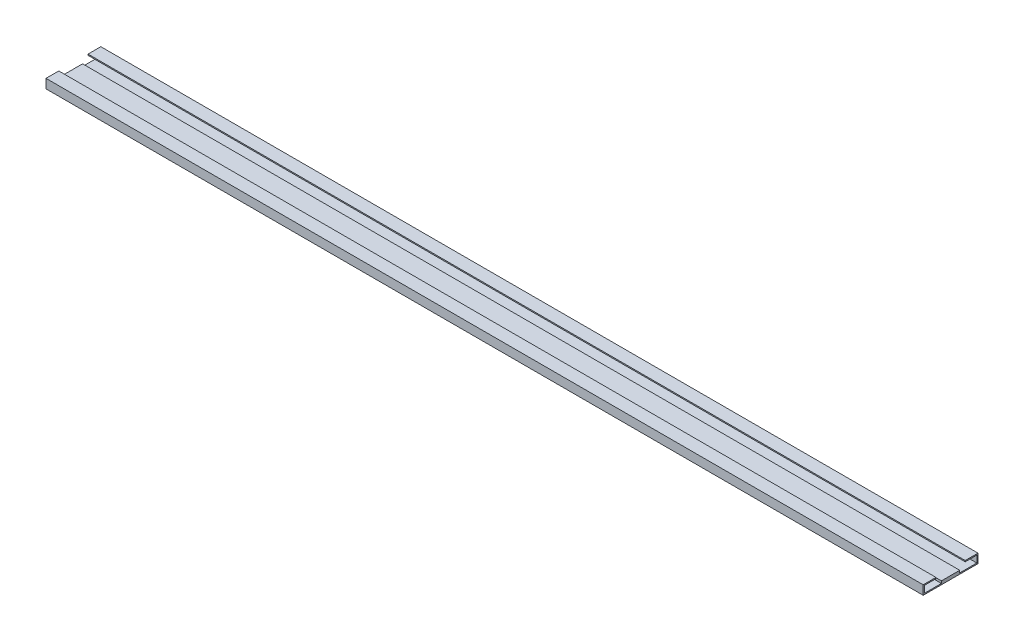
ISO-10303-21;
HEADER;
FILE_DESCRIPTION(('STEP AP214'),'2;1');
FILE_NAME('part.step','',(''),(''),'','','');
FILE_SCHEMA(('AUTOMOTIVE_DESIGN { 1 0 10303 214 1 1 1 1 }'));
ENDSEC;
DATA;
#1=APPLICATION_CONTEXT('core data for automotive mechanical design processes');
#2=APPLICATION_PROTOCOL_DEFINITION('international standard','automotive_design',2000,#1);
#3=PRODUCT_CONTEXT('',#1,'mechanical');
#4=PRODUCT('Part','Part','',(#3));
#5=PRODUCT_RELATED_PRODUCT_CATEGORY('part','',(#4));
#6=PRODUCT_DEFINITION_FORMATION('','',#4);
#7=PRODUCT_DEFINITION_CONTEXT('part definition',#1,'design');
#8=PRODUCT_DEFINITION('design','',#6,#7);
#9=PRODUCT_DEFINITION_SHAPE('','',#8);
#10=(LENGTH_UNIT() NAMED_UNIT(*) SI_UNIT(.MILLI.,.METRE.));
#11=(NAMED_UNIT(*) PLANE_ANGLE_UNIT() SI_UNIT($,.RADIAN.));
#12=(NAMED_UNIT(*) SI_UNIT($,.STERADIAN.) SOLID_ANGLE_UNIT());
#13=UNCERTAINTY_MEASURE_WITH_UNIT(LENGTH_MEASURE(1.E-05),#10,'distance_accuracy_value','');
#14=(GEOMETRIC_REPRESENTATION_CONTEXT(3) GLOBAL_UNCERTAINTY_ASSIGNED_CONTEXT((#13)) GLOBAL_UNIT_ASSIGNED_CONTEXT((#10,
#11,#12)) REPRESENTATION_CONTEXT('',''));
#15=CARTESIAN_POINT('',(0.,0.,0.));
#16=DIRECTION('',(0.,0.,1.));
#17=DIRECTION('',(1.,0.,0.));
#18=AXIS2_PLACEMENT_3D('',#15,#16,#17);
#19=CARTESIAN_POINT('',(0.,6.35,0.));
#20=DIRECTION('',(0.,-1.,0.));
#21=DIRECTION('',(0.,0.,-1.));
#22=AXIS2_PLACEMENT_3D('',#19,#20,#21);
#23=PLANE('',#22);
#24=DIRECTION('',(0.,0.,-1.));
#25=VECTOR('',#24,1.);
#26=CARTESIAN_POINT('',(304.8,6.35,19.05));
#27=LINE('',#26,#25);
#28=CARTESIAN_POINT('',(304.8,6.35,19.05));
#29=VERTEX_POINT('',#28);
#30=CARTESIAN_POINT('',(304.8,6.35,10.16));
#31=VERTEX_POINT('',#30);
#32=EDGE_CURVE('E253',#29,#31,#27,.T.);
#33=ORIENTED_EDGE('',*,*,#32,.T.);
#34=DIRECTION('',(-1.,0.,0.));
#35=VECTOR('',#34,1.);
#36=CARTESIAN_POINT('',(304.8,6.35,10.16));
#37=LINE('',#36,#35);
#38=CARTESIAN_POINT('',(-304.8,6.35,10.16));
#39=VERTEX_POINT('',#38);
#40=EDGE_CURVE('E231',#31,#39,#37,.T.);
#41=ORIENTED_EDGE('',*,*,#40,.T.);
#42=DIRECTION('',(0.,0.,1.));
#43=VECTOR('',#42,1.);
#44=CARTESIAN_POINT('',(-304.8,6.35,19.05));
#45=LINE('',#44,#43);
#46=CARTESIAN_POINT('',(-304.8,6.35,19.05));
#47=VERTEX_POINT('',#46);
#48=EDGE_CURVE('E257',#39,#47,#45,.T.);
#49=ORIENTED_EDGE('',*,*,#48,.T.);
#50=DIRECTION('',(1.,0.,0.));
#51=VECTOR('',#50,1.);
#52=CARTESIAN_POINT('',(-304.8,6.35,19.05));
#53=LINE('',#52,#51);
#54=EDGE_CURVE('E58',#47,#29,#53,.T.);
#55=ORIENTED_EDGE('',*,*,#54,.T.);
#56=EDGE_LOOP('',(#33,#41,#49,#55));
#57=FACE_BOUND('',#56,.T.);
#58=ADVANCED_FACE('F34',(#57),#23,.F.);
#59=CARTESIAN_POINT('',(304.8,6.35,19.05));
#60=DIRECTION('',(-1.,0.,0.));
#61=DIRECTION('',(0.,0.,1.));
#62=AXIS2_PLACEMENT_3D('',#59,#60,#61);
#63=PLANE('',#62);
#64=DIRECTION('',(0.,0.,-1.));
#65=VECTOR('',#64,1.);
#66=CARTESIAN_POINT('',(304.8,5.55625,18.25625));
#67=LINE('',#66,#65);
#68=CARTESIAN_POINT('',(304.8,5.55625,18.25625));
#69=VERTEX_POINT('',#68);
#70=CARTESIAN_POINT('',(304.8,5.55625,10.16));
#71=VERTEX_POINT('',#70);
#72=EDGE_CURVE('E200',#69,#71,#67,.T.);
#73=ORIENTED_EDGE('',*,*,#72,.T.);
#74=DIRECTION('',(0.,1.,0.));
#75=VECTOR('',#74,1.);
#76=CARTESIAN_POINT('',(304.8,5.55625,10.16));
#77=LINE('',#76,#75);
#78=EDGE_CURVE('E202',#71,#31,#77,.T.);
#79=ORIENTED_EDGE('',*,*,#78,.T.);
#80=ORIENTED_EDGE('',*,*,#32,.F.);
#81=DIRECTION('',(0.,-1.,0.));
#82=VECTOR('',#81,1.);
#83=CARTESIAN_POINT('',(304.8,6.35,19.05));
#84=LINE('',#83,#82);
#85=CARTESIAN_POINT('',(304.8,0.,19.05));
#86=VERTEX_POINT('',#85);
#87=EDGE_CURVE('E262',#29,#86,#84,.T.);
#88=ORIENTED_EDGE('',*,*,#87,.T.);
#89=DIRECTION('',(0.,0.,-1.));
#90=VECTOR('',#89,1.);
#91=CARTESIAN_POINT('',(304.8,0.,19.05));
#92=LINE('',#91,#90);
#93=CARTESIAN_POINT('',(304.8,0.,-19.05));
#94=VERTEX_POINT('',#93);
#95=EDGE_CURVE('E234',#86,#94,#92,.T.);
#96=ORIENTED_EDGE('',*,*,#95,.T.);
#97=DIRECTION('',(0.,-1.,0.));
#98=VECTOR('',#97,1.);
#99=CARTESIAN_POINT('',(304.8,6.35,-19.05));
#100=LINE('',#99,#98);
#101=CARTESIAN_POINT('',(304.8,6.35,-19.05));
#102=VERTEX_POINT('',#101);
#103=EDGE_CURVE('E11',#102,#94,#100,.T.);
#104=ORIENTED_EDGE('',*,*,#103,.F.);
#105=CARTESIAN_POINT('',(304.8,6.35,-10.16));
#106=VERTEX_POINT('',#105);
#107=EDGE_CURVE('E86',#106,#102,#27,.T.);
#108=ORIENTED_EDGE('',*,*,#107,.F.);
#109=DIRECTION('',(0.,-1.,0.));
#110=VECTOR('',#109,1.);
#111=CARTESIAN_POINT('',(304.8,6.35,-10.16));
#112=LINE('',#111,#110);
#113=CARTESIAN_POINT('',(304.8,5.55625,-10.16));
#114=VERTEX_POINT('',#113);
#115=EDGE_CURVE('E49',#106,#114,#112,.T.);
#116=ORIENTED_EDGE('',*,*,#115,.T.);
#117=DIRECTION('',(0.,0.,-1.));
#118=VECTOR('',#117,1.);
#119=CARTESIAN_POINT('',(304.8,5.55625,-10.16));
#120=LINE('',#119,#118);
#121=CARTESIAN_POINT('',(304.8,5.55625,-18.25625));
#122=VERTEX_POINT('',#121);
#123=EDGE_CURVE('E167',#114,#122,#120,.T.);
#124=ORIENTED_EDGE('',*,*,#123,.T.);
#125=DIRECTION('',(0.,-1.,0.));
#126=VECTOR('',#125,1.);
#127=CARTESIAN_POINT('',(304.8,5.55625,-18.25625));
#128=LINE('',#127,#126);
#129=CARTESIAN_POINT('',(304.8,0.79375,-18.25625));
#130=VERTEX_POINT('',#129);
#131=EDGE_CURVE('E172',#122,#130,#128,.T.);
#132=ORIENTED_EDGE('',*,*,#131,.T.);
#133=DIRECTION('',(0.,0.,1.));
#134=VECTOR('',#133,1.);
#135=CARTESIAN_POINT('',(304.8,0.79375,-18.25625));
#136=LINE('',#135,#134);
#137=CARTESIAN_POINT('',(304.8,0.79375,-6.35));
#138=VERTEX_POINT('',#137);
#139=EDGE_CURVE('E182',#130,#138,#136,.T.);
#140=ORIENTED_EDGE('',*,*,#139,.T.);
#141=DIRECTION('',(0.,1.,0.));
#142=VECTOR('',#141,1.);
#143=CARTESIAN_POINT('',(304.8,0.79375,-6.35));
#144=LINE('',#143,#142);
#145=CARTESIAN_POINT('',(304.8,2.38125,-6.35));
#146=VERTEX_POINT('',#145);
#147=EDGE_CURVE('E185',#138,#146,#144,.T.);
#148=ORIENTED_EDGE('',*,*,#147,.T.);
#149=DIRECTION('',(0.,0.,1.));
#150=VECTOR('',#149,1.);
#151=CARTESIAN_POINT('',(304.8,2.38125,-6.35));
#152=LINE('',#151,#150);
#153=CARTESIAN_POINT('',(304.8,2.38125,6.35));
#154=VERTEX_POINT('',#153);
#155=EDGE_CURVE('E188',#146,#154,#152,.T.);
#156=ORIENTED_EDGE('',*,*,#155,.T.);
#157=DIRECTION('',(0.,-1.,0.));
#158=VECTOR('',#157,1.);
#159=CARTESIAN_POINT('',(304.8,2.38125,6.35));
#160=LINE('',#159,#158);
#161=CARTESIAN_POINT('',(304.8,0.79375,6.35));
#162=VERTEX_POINT('',#161);
#163=EDGE_CURVE('E191',#154,#162,#160,.T.);
#164=ORIENTED_EDGE('',*,*,#163,.T.);
#165=DIRECTION('',(0.,0.,1.));
#166=VECTOR('',#165,1.);
#167=CARTESIAN_POINT('',(304.8,0.79375,6.35));
#168=LINE('',#167,#166);
#169=CARTESIAN_POINT('',(304.8,0.79375,18.25625));
#170=VERTEX_POINT('',#169);
#171=EDGE_CURVE('E194',#162,#170,#168,.T.);
#172=ORIENTED_EDGE('',*,*,#171,.T.);
#173=DIRECTION('',(0.,1.,0.));
#174=VECTOR('',#173,1.);
#175=CARTESIAN_POINT('',(304.8,0.79375,18.25625));
#176=LINE('',#175,#174);
#177=EDGE_CURVE('E197',#170,#69,#176,.T.);
#178=ORIENTED_EDGE('',*,*,#177,.T.);
#179=EDGE_LOOP('',(#73,#79,#80,#88,#96,#104,#108,#116,#124,#132,#140,#148,#156,#164,#172,#178));
#180=FACE_BOUND('',#179,.T.);
#181=ADVANCED_FACE('F36',(#180),#63,.F.);
#182=CARTESIAN_POINT('',(-304.8,6.35,-19.05));
#183=DIRECTION('',(0.,0.,1.));
#184=DIRECTION('',(1.,0.,0.));
#185=AXIS2_PLACEMENT_3D('',#182,#183,#184);
#186=PLANE('',#185);
#187=DIRECTION('',(-1.,0.,0.));
#188=VECTOR('',#187,1.);
#189=CARTESIAN_POINT('',(-304.8,0.,-19.05));
#190=LINE('',#189,#188);
#191=CARTESIAN_POINT('',(-304.8,0.,-19.05));
#192=VERTEX_POINT('',#191);
#193=EDGE_CURVE('E265',#94,#192,#190,.T.);
#194=ORIENTED_EDGE('',*,*,#193,.T.);
#195=DIRECTION('',(0.,-1.,0.));
#196=VECTOR('',#195,1.);
#197=CARTESIAN_POINT('',(-304.8,6.35,-19.05));
#198=LINE('',#197,#196);
#199=CARTESIAN_POINT('',(-304.8,6.35,-19.05));
#200=VERTEX_POINT('',#199);
#201=EDGE_CURVE('E42',#200,#192,#198,.T.);
#202=ORIENTED_EDGE('',*,*,#201,.F.);
#203=DIRECTION('',(-1.,0.,0.));
#204=VECTOR('',#203,1.);
#205=CARTESIAN_POINT('',(-304.8,6.35,-19.05));
#206=LINE('',#205,#204);
#207=EDGE_CURVE('E255',#102,#200,#206,.T.);
#208=ORIENTED_EDGE('',*,*,#207,.F.);
#209=ORIENTED_EDGE('',*,*,#103,.T.);
#210=EDGE_LOOP('',(#194,#202,#208,#209));
#211=FACE_BOUND('',#210,.T.);
#212=ADVANCED_FACE('F335',(#211),#186,.F.);
#213=CARTESIAN_POINT('',(-304.8,6.35,19.05));
#214=DIRECTION('',(1.,0.,0.));
#215=DIRECTION('',(0.,0.,-1.));
#216=AXIS2_PLACEMENT_3D('',#213,#214,#215);
#217=PLANE('',#216);
#218=ORIENTED_EDGE('',*,*,#48,.F.);
#219=DIRECTION('',(0.,1.,0.));
#220=VECTOR('',#219,1.);
#221=CARTESIAN_POINT('',(-304.8,5.55625,10.16));
#222=LINE('',#221,#220);
#223=CARTESIAN_POINT('',(-304.8,5.55625,10.16));
#224=VERTEX_POINT('',#223);
#225=EDGE_CURVE('E176',#224,#39,#222,.T.);
#226=ORIENTED_EDGE('',*,*,#225,.F.);
#227=DIRECTION('',(0.,0.,-1.));
#228=VECTOR('',#227,1.);
#229=CARTESIAN_POINT('',(-304.8,5.55625,18.25625));
#230=LINE('',#229,#228);
#231=CARTESIAN_POINT('',(-304.8,5.55625,18.25625));
#232=VERTEX_POINT('',#231);
#233=EDGE_CURVE('E178',#232,#224,#230,.T.);
#234=ORIENTED_EDGE('',*,*,#233,.F.);
#235=DIRECTION('',(0.,1.,0.));
#236=VECTOR('',#235,1.);
#237=CARTESIAN_POINT('',(-304.8,0.79375,18.25625));
#238=LINE('',#237,#236);
#239=CARTESIAN_POINT('',(-304.8,0.79375,18.25625));
#240=VERTEX_POINT('',#239);
#241=EDGE_CURVE('E226',#240,#232,#238,.T.);
#242=ORIENTED_EDGE('',*,*,#241,.F.);
#243=DIRECTION('',(0.,0.,1.));
#244=VECTOR('',#243,1.);
#245=CARTESIAN_POINT('',(-304.8,0.79375,6.35));
#246=LINE('',#245,#244);
#247=CARTESIAN_POINT('',(-304.8,0.79375,6.35));
#248=VERTEX_POINT('',#247);
#249=EDGE_CURVE('E223',#248,#240,#246,.T.);
#250=ORIENTED_EDGE('',*,*,#249,.F.);
#251=DIRECTION('',(0.,-1.,0.));
#252=VECTOR('',#251,1.);
#253=CARTESIAN_POINT('',(-304.8,2.38125,6.35));
#254=LINE('',#253,#252);
#255=CARTESIAN_POINT('',(-304.8,2.38125,6.35));
#256=VERTEX_POINT('',#255);
#257=EDGE_CURVE('E220',#256,#248,#254,.T.);
#258=ORIENTED_EDGE('',*,*,#257,.F.);
#259=DIRECTION('',(0.,0.,1.));
#260=VECTOR('',#259,1.);
#261=CARTESIAN_POINT('',(-304.8,2.38125,-6.35));
#262=LINE('',#261,#260);
#263=CARTESIAN_POINT('',(-304.8,2.38125,-6.35));
#264=VERTEX_POINT('',#263);
#265=EDGE_CURVE('E217',#264,#256,#262,.T.);
#266=ORIENTED_EDGE('',*,*,#265,.F.);
#267=DIRECTION('',(0.,1.,0.));
#268=VECTOR('',#267,1.);
#269=CARTESIAN_POINT('',(-304.8,0.79375,-6.35));
#270=LINE('',#269,#268);
#271=CARTESIAN_POINT('',(-304.8,0.79375,-6.35));
#272=VERTEX_POINT('',#271);
#273=EDGE_CURVE('E214',#272,#264,#270,.T.);
#274=ORIENTED_EDGE('',*,*,#273,.F.);
#275=DIRECTION('',(0.,0.,1.));
#276=VECTOR('',#275,1.);
#277=CARTESIAN_POINT('',(-304.8,0.79375,-18.25625));
#278=LINE('',#277,#276);
#279=CARTESIAN_POINT('',(-304.8,0.79375,-18.25625));
#280=VERTEX_POINT('',#279);
#281=EDGE_CURVE('E211',#280,#272,#278,.T.);
#282=ORIENTED_EDGE('',*,*,#281,.F.);
#283=DIRECTION('',(0.,-1.,0.));
#284=VECTOR('',#283,1.);
#285=CARTESIAN_POINT('',(-304.8,5.55625,-18.25625));
#286=LINE('',#285,#284);
#287=CARTESIAN_POINT('',(-304.8,5.55625,-18.25625));
#288=VERTEX_POINT('',#287);
#289=EDGE_CURVE('E208',#288,#280,#286,.T.);
#290=ORIENTED_EDGE('',*,*,#289,.F.);
#291=DIRECTION('',(0.,0.,-1.));
#292=VECTOR('',#291,1.);
#293=CARTESIAN_POINT('',(-304.8,5.55625,-10.16));
#294=LINE('',#293,#292);
#295=CARTESIAN_POINT('',(-304.8,5.55625,-10.16));
#296=VERTEX_POINT('',#295);
#297=EDGE_CURVE('E206',#296,#288,#294,.T.);
#298=ORIENTED_EDGE('',*,*,#297,.F.);
#299=DIRECTION('',(0.,-1.,0.));
#300=VECTOR('',#299,1.);
#301=CARTESIAN_POINT('',(-304.8,6.35,-10.16));
#302=LINE('',#301,#300);
#303=CARTESIAN_POINT('',(-304.8,6.35,-10.16));
#304=VERTEX_POINT('',#303);
#305=EDGE_CURVE('E159',#304,#296,#302,.T.);
#306=ORIENTED_EDGE('',*,*,#305,.F.);
#307=EDGE_CURVE('E258',#200,#304,#45,.T.);
#308=ORIENTED_EDGE('',*,*,#307,.F.);
#309=ORIENTED_EDGE('',*,*,#201,.T.);
#310=DIRECTION('',(0.,0.,1.));
#311=VECTOR('',#310,1.);
#312=CARTESIAN_POINT('',(-304.8,0.,19.05));
#313=LINE('',#312,#311);
#314=CARTESIAN_POINT('',(-304.8,0.,19.05));
#315=VERTEX_POINT('',#314);
#316=EDGE_CURVE('E267',#192,#315,#313,.T.);
#317=ORIENTED_EDGE('',*,*,#316,.T.);
#318=DIRECTION('',(0.,-1.,0.));
#319=VECTOR('',#318,1.);
#320=CARTESIAN_POINT('',(-304.8,6.35,19.05));
#321=LINE('',#320,#319);
#322=EDGE_CURVE('E271',#47,#315,#321,.T.);
#323=ORIENTED_EDGE('',*,*,#322,.F.);
#324=EDGE_LOOP('',(#218,#226,#234,#242,#250,#258,#266,#274,#282,#290,#298,#306,#308,#309,#317,#323));
#325=FACE_BOUND('',#324,.T.);
#326=ADVANCED_FACE('F278',(#325),#217,.F.);
#327=CARTESIAN_POINT('',(-304.8,6.35,19.05));
#328=DIRECTION('',(0.,0.,-1.));
#329=DIRECTION('',(-1.,0.,0.));
#330=AXIS2_PLACEMENT_3D('',#327,#328,#329);
#331=PLANE('',#330);
#332=DIRECTION('',(1.,0.,0.));
#333=VECTOR('',#332,1.);
#334=CARTESIAN_POINT('',(-304.8,0.,19.05));
#335=LINE('',#334,#333);
#336=EDGE_CURVE('E79',#315,#86,#335,.T.);
#337=ORIENTED_EDGE('',*,*,#336,.T.);
#338=ORIENTED_EDGE('',*,*,#87,.F.);
#339=ORIENTED_EDGE('',*,*,#54,.F.);
#340=ORIENTED_EDGE('',*,*,#322,.T.);
#341=EDGE_LOOP('',(#337,#338,#339,#340));
#342=FACE_BOUND('',#341,.T.);
#343=ADVANCED_FACE('F285',(#342),#331,.F.);
#344=ORIENTED_EDGE('',*,*,#307,.T.);
#345=DIRECTION('',(-1.,0.,0.));
#346=VECTOR('',#345,1.);
#347=CARTESIAN_POINT('',(304.8,6.35,-10.16));
#348=LINE('',#347,#346);
#349=EDGE_CURVE('E164',#106,#304,#348,.T.);
#350=ORIENTED_EDGE('',*,*,#349,.F.);
#351=ORIENTED_EDGE('',*,*,#107,.T.);
#352=ORIENTED_EDGE('',*,*,#207,.T.);
#353=EDGE_LOOP('',(#344,#350,#351,#352));
#354=FACE_BOUND('',#353,.T.);
#355=ADVANCED_FACE('F331',(#354),#23,.F.);
#356=CARTESIAN_POINT('',(0.,0.,0.));
#357=DIRECTION('',(0.,-1.,0.));
#358=DIRECTION('',(0.,0.,-1.));
#359=AXIS2_PLACEMENT_3D('',#356,#357,#358);
#360=PLANE('',#359);
#361=ORIENTED_EDGE('',*,*,#95,.F.);
#362=ORIENTED_EDGE('',*,*,#336,.F.);
#363=ORIENTED_EDGE('',*,*,#316,.F.);
#364=ORIENTED_EDGE('',*,*,#193,.F.);
#365=EDGE_LOOP('',(#361,#362,#363,#364));
#366=FACE_BOUND('',#365,.T.);
#367=ADVANCED_FACE('F283',(#366),#360,.T.);
#368=CARTESIAN_POINT('',(304.8,5.55625,10.16));
#369=DIRECTION('',(0.,0.,1.));
#370=DIRECTION('',(0.,-1.,0.));
#371=AXIS2_PLACEMENT_3D('',#368,#369,#370);
#372=PLANE('',#371);
#373=ORIENTED_EDGE('',*,*,#225,.T.);
#374=ORIENTED_EDGE('',*,*,#40,.F.);
#375=ORIENTED_EDGE('',*,*,#78,.F.);
#376=DIRECTION('',(-1.,0.,0.));
#377=VECTOR('',#376,1.);
#378=CARTESIAN_POINT('',(304.8,5.55625,10.16));
#379=LINE('',#378,#377);
#380=EDGE_CURVE('E235',#71,#224,#379,.T.);
#381=ORIENTED_EDGE('',*,*,#380,.T.);
#382=EDGE_LOOP('',(#373,#374,#375,#381));
#383=FACE_BOUND('',#382,.T.);
#384=ADVANCED_FACE('F290',(#383),#372,.F.);
#385=CARTESIAN_POINT('',(304.8,5.55625,18.25625));
#386=DIRECTION('',(0.,1.,0.));
#387=DIRECTION('',(0.,0.,1.));
#388=AXIS2_PLACEMENT_3D('',#385,#386,#387);
#389=PLANE('',#388);
#390=ORIENTED_EDGE('',*,*,#233,.T.);
#391=ORIENTED_EDGE('',*,*,#380,.F.);
#392=ORIENTED_EDGE('',*,*,#72,.F.);
#393=DIRECTION('',(-1.,0.,0.));
#394=VECTOR('',#393,1.);
#395=CARTESIAN_POINT('',(304.8,5.55625,18.25625));
#396=LINE('',#395,#394);
#397=EDGE_CURVE('E237',#69,#232,#396,.T.);
#398=ORIENTED_EDGE('',*,*,#397,.T.);
#399=EDGE_LOOP('',(#390,#391,#392,#398));
#400=FACE_BOUND('',#399,.T.);
#401=ADVANCED_FACE('F294',(#400),#389,.F.);
#402=CARTESIAN_POINT('',(304.8,0.79375,18.25625));
#403=DIRECTION('',(0.,0.,1.));
#404=DIRECTION('',(1.,0.,0.));
#405=AXIS2_PLACEMENT_3D('',#402,#403,#404);
#406=PLANE('',#405);
#407=ORIENTED_EDGE('',*,*,#241,.T.);
#408=ORIENTED_EDGE('',*,*,#397,.F.);
#409=ORIENTED_EDGE('',*,*,#177,.F.);
#410=DIRECTION('',(-1.,0.,0.));
#411=VECTOR('',#410,1.);
#412=CARTESIAN_POINT('',(304.8,0.79375,18.25625));
#413=LINE('',#412,#411);
#414=EDGE_CURVE('E239',#170,#240,#413,.T.);
#415=ORIENTED_EDGE('',*,*,#414,.T.);
#416=EDGE_LOOP('',(#407,#408,#409,#415));
#417=FACE_BOUND('',#416,.T.);
#418=ADVANCED_FACE('F299',(#417),#406,.F.);
#419=CARTESIAN_POINT('',(304.8,0.79375,6.35));
#420=DIRECTION('',(0.,-1.,0.));
#421=DIRECTION('',(0.,0.,-1.));
#422=AXIS2_PLACEMENT_3D('',#419,#420,#421);
#423=PLANE('',#422);
#424=ORIENTED_EDGE('',*,*,#249,.T.);
#425=ORIENTED_EDGE('',*,*,#414,.F.);
#426=ORIENTED_EDGE('',*,*,#171,.F.);
#427=DIRECTION('',(-1.,0.,0.));
#428=VECTOR('',#427,1.);
#429=CARTESIAN_POINT('',(304.8,0.79375,6.35));
#430=LINE('',#429,#428);
#431=EDGE_CURVE('E241',#162,#248,#430,.T.);
#432=ORIENTED_EDGE('',*,*,#431,.T.);
#433=EDGE_LOOP('',(#424,#425,#426,#432));
#434=FACE_BOUND('',#433,.T.);
#435=ADVANCED_FACE('F302',(#434),#423,.F.);
#436=CARTESIAN_POINT('',(304.8,2.38125,6.35));
#437=DIRECTION('',(0.,0.,-1.));
#438=DIRECTION('',(-1.,0.,0.));
#439=AXIS2_PLACEMENT_3D('',#436,#437,#438);
#440=PLANE('',#439);
#441=ORIENTED_EDGE('',*,*,#257,.T.);
#442=ORIENTED_EDGE('',*,*,#431,.F.);
#443=ORIENTED_EDGE('',*,*,#163,.F.);
#444=DIRECTION('',(-1.,0.,0.));
#445=VECTOR('',#444,1.);
#446=CARTESIAN_POINT('',(304.8,2.38125,6.35));
#447=LINE('',#446,#445);
#448=EDGE_CURVE('E243',#154,#256,#447,.T.);
#449=ORIENTED_EDGE('',*,*,#448,.T.);
#450=EDGE_LOOP('',(#441,#442,#443,#449));
#451=FACE_BOUND('',#450,.T.);
#452=ADVANCED_FACE('F305',(#451),#440,.F.);
#453=CARTESIAN_POINT('',(304.8,2.38125,-6.35));
#454=DIRECTION('',(0.,-1.,0.));
#455=DIRECTION('',(0.,0.,-1.));
#456=AXIS2_PLACEMENT_3D('',#453,#454,#455);
#457=PLANE('',#456);
#458=ORIENTED_EDGE('',*,*,#265,.T.);
#459=ORIENTED_EDGE('',*,*,#448,.F.);
#460=ORIENTED_EDGE('',*,*,#155,.F.);
#461=DIRECTION('',(-1.,0.,0.));
#462=VECTOR('',#461,1.);
#463=CARTESIAN_POINT('',(304.8,2.38125,-6.35));
#464=LINE('',#463,#462);
#465=EDGE_CURVE('E245',#146,#264,#464,.T.);
#466=ORIENTED_EDGE('',*,*,#465,.T.);
#467=EDGE_LOOP('',(#458,#459,#460,#466));
#468=FACE_BOUND('',#467,.T.);
#469=ADVANCED_FACE('F310',(#468),#457,.F.);
#470=CARTESIAN_POINT('',(304.8,0.79375,-6.35));
#471=DIRECTION('',(0.,0.,1.));
#472=DIRECTION('',(1.,0.,0.));
#473=AXIS2_PLACEMENT_3D('',#470,#471,#472);
#474=PLANE('',#473);
#475=ORIENTED_EDGE('',*,*,#273,.T.);
#476=ORIENTED_EDGE('',*,*,#465,.F.);
#477=ORIENTED_EDGE('',*,*,#147,.F.);
#478=DIRECTION('',(-1.,0.,0.));
#479=VECTOR('',#478,1.);
#480=CARTESIAN_POINT('',(304.8,0.79375,-6.35));
#481=LINE('',#480,#479);
#482=EDGE_CURVE('E247',#138,#272,#481,.T.);
#483=ORIENTED_EDGE('',*,*,#482,.T.);
#484=EDGE_LOOP('',(#475,#476,#477,#483));
#485=FACE_BOUND('',#484,.T.);
#486=ADVANCED_FACE('F314',(#485),#474,.F.);
#487=CARTESIAN_POINT('',(304.8,0.79375,-18.25625));
#488=DIRECTION('',(0.,-1.,0.));
#489=DIRECTION('',(0.,0.,-1.));
#490=AXIS2_PLACEMENT_3D('',#487,#488,#489);
#491=PLANE('',#490);
#492=ORIENTED_EDGE('',*,*,#281,.T.);
#493=ORIENTED_EDGE('',*,*,#482,.F.);
#494=ORIENTED_EDGE('',*,*,#139,.F.);
#495=DIRECTION('',(-1.,0.,0.));
#496=VECTOR('',#495,1.);
#497=CARTESIAN_POINT('',(304.8,0.79375,-18.25625));
#498=LINE('',#497,#496);
#499=EDGE_CURVE('E249',#130,#280,#498,.T.);
#500=ORIENTED_EDGE('',*,*,#499,.T.);
#501=EDGE_LOOP('',(#492,#493,#494,#500));
#502=FACE_BOUND('',#501,.T.);
#503=ADVANCED_FACE('F317',(#502),#491,.F.);
#504=CARTESIAN_POINT('',(304.8,5.55625,-18.25625));
#505=DIRECTION('',(0.,0.,-1.));
#506=DIRECTION('',(-1.,0.,0.));
#507=AXIS2_PLACEMENT_3D('',#504,#505,#506);
#508=PLANE('',#507);
#509=ORIENTED_EDGE('',*,*,#289,.T.);
#510=ORIENTED_EDGE('',*,*,#499,.F.);
#511=ORIENTED_EDGE('',*,*,#131,.F.);
#512=DIRECTION('',(-1.,0.,0.));
#513=VECTOR('',#512,1.);
#514=CARTESIAN_POINT('',(304.8,5.55625,-18.25625));
#515=LINE('',#514,#513);
#516=EDGE_CURVE('E163',#122,#288,#515,.T.);
#517=ORIENTED_EDGE('',*,*,#516,.T.);
#518=EDGE_LOOP('',(#509,#510,#511,#517));
#519=FACE_BOUND('',#518,.T.);
#520=ADVANCED_FACE('F320',(#519),#508,.F.);
#521=CARTESIAN_POINT('',(304.8,5.55625,-10.16));
#522=DIRECTION('',(0.,1.,0.));
#523=DIRECTION('',(0.,0.,1.));
#524=AXIS2_PLACEMENT_3D('',#521,#522,#523);
#525=PLANE('',#524);
#526=ORIENTED_EDGE('',*,*,#297,.T.);
#527=ORIENTED_EDGE('',*,*,#516,.F.);
#528=ORIENTED_EDGE('',*,*,#123,.F.);
#529=DIRECTION('',(-1.,0.,0.));
#530=VECTOR('',#529,1.);
#531=CARTESIAN_POINT('',(304.8,5.55625,-10.16));
#532=LINE('',#531,#530);
#533=EDGE_CURVE('E155',#114,#296,#532,.T.);
#534=ORIENTED_EDGE('',*,*,#533,.T.);
#535=EDGE_LOOP('',(#526,#527,#528,#534));
#536=FACE_BOUND('',#535,.T.);
#537=ADVANCED_FACE('F168',(#536),#525,.F.);
#538=CARTESIAN_POINT('',(304.8,6.35,-10.16));
#539=DIRECTION('',(0.,0.,-1.));
#540=DIRECTION('',(-1.,0.,0.));
#541=AXIS2_PLACEMENT_3D('',#538,#539,#540);
#542=PLANE('',#541);
#543=ORIENTED_EDGE('',*,*,#305,.T.);
#544=ORIENTED_EDGE('',*,*,#533,.F.);
#545=ORIENTED_EDGE('',*,*,#115,.F.);
#546=ORIENTED_EDGE('',*,*,#349,.T.);
#547=EDGE_LOOP('',(#543,#544,#545,#546));
#548=FACE_BOUND('',#547,.T.);
#549=ADVANCED_FACE('F157',(#548),#542,.F.);
#550=CLOSED_SHELL('',(#58,#181,#212,#326,#343,#355,#367,#384,#401,#418,#435,#452,#469,#486,#503,
#520,#537,#549));
#551=MANIFOLD_SOLID_BREP('B2',#550);
#552=ADVANCED_BREP_SHAPE_REPRESENTATION('',(#18,#551),#14);
#553=SHAPE_DEFINITION_REPRESENTATION(#9,#552);
ENDSEC;
END-ISO-10303-21;
